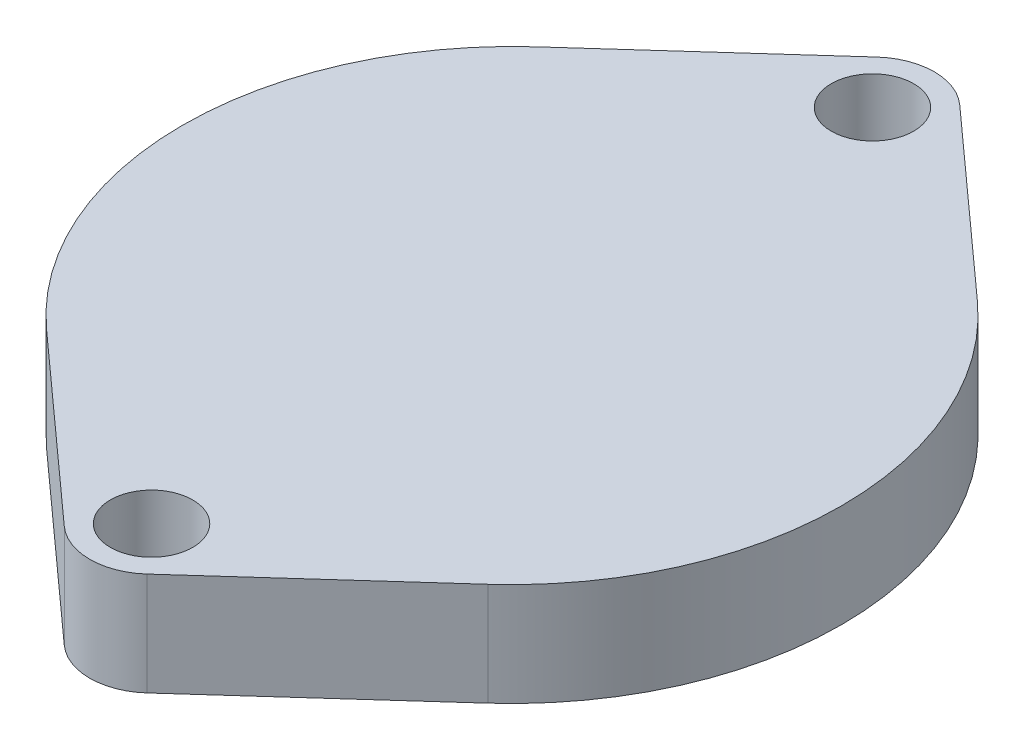
ISO-10303-21;
HEADER;
FILE_DESCRIPTION(('STEP AP214'),'2;1');
FILE_NAME('part.step','',(''),(''),'','','');
FILE_SCHEMA(('AUTOMOTIVE_DESIGN { 1 0 10303 214 1 1 1 1 }'));
ENDSEC;
DATA;
#1=APPLICATION_CONTEXT('core data for automotive mechanical design processes');
#2=APPLICATION_PROTOCOL_DEFINITION('international standard','automotive_design',2000,#1);
#3=PRODUCT_CONTEXT('',#1,'mechanical');
#4=PRODUCT('Part','Part','',(#3));
#5=PRODUCT_RELATED_PRODUCT_CATEGORY('part','',(#4));
#6=PRODUCT_DEFINITION_FORMATION('','',#4);
#7=PRODUCT_DEFINITION_CONTEXT('part definition',#1,'design');
#8=PRODUCT_DEFINITION('design','',#6,#7);
#9=PRODUCT_DEFINITION_SHAPE('','',#8);
#10=(LENGTH_UNIT() NAMED_UNIT(*) SI_UNIT(.MILLI.,.METRE.));
#11=(NAMED_UNIT(*) PLANE_ANGLE_UNIT() SI_UNIT($,.RADIAN.));
#12=(NAMED_UNIT(*) SI_UNIT($,.STERADIAN.) SOLID_ANGLE_UNIT());
#13=UNCERTAINTY_MEASURE_WITH_UNIT(LENGTH_MEASURE(1.E-05),#10,'distance_accuracy_value','');
#14=(GEOMETRIC_REPRESENTATION_CONTEXT(3) GLOBAL_UNCERTAINTY_ASSIGNED_CONTEXT((#13)) GLOBAL_UNIT_ASSIGNED_CONTEXT((#10,
#11,#12)) REPRESENTATION_CONTEXT('',''));
#15=CARTESIAN_POINT('',(0.,0.,0.));
#16=DIRECTION('',(0.,0.,1.));
#17=DIRECTION('',(1.,0.,0.));
#18=AXIS2_PLACEMENT_3D('',#15,#16,#17);
#19=CARTESIAN_POINT('',(0.,5.,17.5));
#20=DIRECTION('',(0.,-1.,0.));
#21=DIRECTION('',(0.,0.,-1.));
#22=AXIS2_PLACEMENT_3D('',#19,#20,#21);
#23=CYLINDRICAL_SURFACE('',#22,3.);
#24=CARTESIAN_POINT('',(0.,0.,17.5));
#25=DIRECTION('',(0.,1.,0.));
#26=DIRECTION('',(0.,0.,1.));
#27=AXIS2_PLACEMENT_3D('',#24,#25,#26);
#28=CIRCLE('',#27,3.);
#29=CARTESIAN_POINT('',(2.00834991666171,0.,19.7285714285714));
#30=VERTEX_POINT('',#29);
#31=CARTESIAN_POINT('',(-2.00834991666171,0.,19.7285714285714));
#32=VERTEX_POINT('',#31);
#33=EDGE_CURVE('E151',#30,#32,#28,.F.);
#34=ORIENTED_EDGE('',*,*,#33,.F.);
#35=DIRECTION('',(0.,-1.,0.));
#36=VECTOR('',#35,1.);
#37=CARTESIAN_POINT('',(2.00834991666171,5.,19.7285714285714));
#38=LINE('',#37,#36);
#39=CARTESIAN_POINT('',(2.00834991666171,5.,19.7285714285714));
#40=VERTEX_POINT('',#39);
#41=EDGE_CURVE('E11',#40,#30,#38,.T.);
#42=ORIENTED_EDGE('',*,*,#41,.F.);
#43=CARTESIAN_POINT('',(0.,5.,17.5));
#44=DIRECTION('',(0.,1.,0.));
#45=DIRECTION('',(0.,0.,1.));
#46=AXIS2_PLACEMENT_3D('',#43,#44,#45);
#47=CIRCLE('',#46,3.);
#48=CARTESIAN_POINT('',(-2.00834991666171,5.,19.7285714285714));
#49=VERTEX_POINT('',#48);
#50=EDGE_CURVE('E264',#40,#49,#47,.F.);
#51=ORIENTED_EDGE('',*,*,#50,.T.);
#52=DIRECTION('',(0.,-1.,0.));
#53=VECTOR('',#52,1.);
#54=CARTESIAN_POINT('',(-2.00834991666171,5.,19.7285714285714));
#55=LINE('',#54,#53);
#56=EDGE_CURVE('E52',#49,#32,#55,.T.);
#57=ORIENTED_EDGE('',*,*,#56,.T.);
#58=EDGE_LOOP('',(#34,#42,#51,#57));
#59=FACE_BOUND('',#58,.T.);
#60=ADVANCED_FACE('F35',(#59),#23,.T.);
#61=CARTESIAN_POINT('',(10.7111995555291,5.,11.8857142857143));
#62=DIRECTION('',(-0.66944997222057,0.,-0.742857142857143));
#63=DIRECTION('',(-0.742857142857143,0.,0.66944997222057));
#64=AXIS2_PLACEMENT_3D('',#61,#62,#63);
#65=PLANE('',#64);
#66=DIRECTION('',(0.742857142857143,0.,-0.66944997222057));
#67=VECTOR('',#66,1.);
#68=CARTESIAN_POINT('',(10.7111995555291,0.,11.8857142857143));
#69=LINE('',#68,#67);
#70=CARTESIAN_POINT('',(10.7111995555291,0.,11.8857142857143));
#71=VERTEX_POINT('',#70);
#72=EDGE_CURVE('E148',#30,#71,#69,.T.);
#73=ORIENTED_EDGE('',*,*,#72,.T.);
#74=DIRECTION('',(0.,-1.,0.));
#75=VECTOR('',#74,1.);
#76=CARTESIAN_POINT('',(10.7111995555291,5.,11.8857142857143));
#77=LINE('',#76,#75);
#78=CARTESIAN_POINT('',(10.7111995555291,5.,11.8857142857143));
#79=VERTEX_POINT('',#78);
#80=EDGE_CURVE('E44',#79,#71,#77,.T.);
#81=ORIENTED_EDGE('',*,*,#80,.F.);
#82=DIRECTION('',(0.742857142857143,0.,-0.66944997222057));
#83=VECTOR('',#82,1.);
#84=CARTESIAN_POINT('',(10.7111995555291,5.,11.8857142857143));
#85=LINE('',#84,#83);
#86=EDGE_CURVE('E266',#40,#79,#85,.T.);
#87=ORIENTED_EDGE('',*,*,#86,.F.);
#88=ORIENTED_EDGE('',*,*,#41,.T.);
#89=EDGE_LOOP('',(#73,#81,#87,#88));
#90=FACE_BOUND('',#89,.T.);
#91=ADVANCED_FACE('F149',(#90),#65,.F.);
#92=CARTESIAN_POINT('',(0.,5.,0.));
#93=DIRECTION('',(0.,-1.,0.));
#94=DIRECTION('',(0.,0.,-1.));
#95=AXIS2_PLACEMENT_3D('',#92,#93,#94);
#96=CYLINDRICAL_SURFACE('',#95,16.);
#97=CARTESIAN_POINT('',(0.,0.,0.));
#98=DIRECTION('',(0.,1.,0.));
#99=DIRECTION('',(0.,0.,1.));
#100=AXIS2_PLACEMENT_3D('',#97,#98,#99);
#101=CIRCLE('',#100,16.);
#102=CARTESIAN_POINT('',(10.7111995555291,0.,-11.8857142857143));
#103=VERTEX_POINT('',#102);
#104=EDGE_CURVE('E142',#103,#71,#101,.F.);
#105=ORIENTED_EDGE('',*,*,#104,.F.);
#106=DIRECTION('',(0.,-1.,0.));
#107=VECTOR('',#106,1.);
#108=CARTESIAN_POINT('',(10.7111995555291,5.,-11.8857142857143));
#109=LINE('',#108,#107);
#110=CARTESIAN_POINT('',(10.7111995555291,5.,-11.8857142857143));
#111=VERTEX_POINT('',#110);
#112=EDGE_CURVE('E134',#111,#103,#109,.T.);
#113=ORIENTED_EDGE('',*,*,#112,.F.);
#114=CARTESIAN_POINT('',(0.,5.,0.));
#115=DIRECTION('',(0.,1.,0.));
#116=DIRECTION('',(0.,0.,1.));
#117=AXIS2_PLACEMENT_3D('',#114,#115,#116);
#118=CIRCLE('',#117,16.);
#119=EDGE_CURVE('E145',#111,#79,#118,.F.);
#120=ORIENTED_EDGE('',*,*,#119,.T.);
#121=ORIENTED_EDGE('',*,*,#80,.T.);
#122=EDGE_LOOP('',(#105,#113,#120,#121));
#123=FACE_BOUND('',#122,.T.);
#124=ADVANCED_FACE('F140',(#123),#96,.T.);
#125=CARTESIAN_POINT('',(10.7111995555291,5.,-11.8857142857143));
#126=DIRECTION('',(0.66944997222057,0.,-0.742857142857143));
#127=DIRECTION('',(-0.742857142857143,0.,-0.66944997222057));
#128=AXIS2_PLACEMENT_3D('',#125,#126,#127);
#129=PLANE('',#128);
#130=DIRECTION('',(0.742857142857143,0.,0.66944997222057));
#131=VECTOR('',#130,1.);
#132=CARTESIAN_POINT('',(10.7111995555291,0.,-11.8857142857143));
#133=LINE('',#132,#131);
#134=CARTESIAN_POINT('',(2.00834991666171,0.,-19.7285714285714));
#135=VERTEX_POINT('',#134);
#136=EDGE_CURVE('E157',#135,#103,#133,.T.);
#137=ORIENTED_EDGE('',*,*,#136,.F.);
#138=DIRECTION('',(0.,-1.,0.));
#139=VECTOR('',#138,1.);
#140=CARTESIAN_POINT('',(2.00834991666171,5.,-19.7285714285714));
#141=LINE('',#140,#139);
#142=CARTESIAN_POINT('',(2.00834991666171,5.,-19.7285714285714));
#143=VERTEX_POINT('',#142);
#144=EDGE_CURVE('E128',#143,#135,#141,.T.);
#145=ORIENTED_EDGE('',*,*,#144,.F.);
#146=DIRECTION('',(0.742857142857143,0.,0.66944997222057));
#147=VECTOR('',#146,1.);
#148=CARTESIAN_POINT('',(10.7111995555291,5.,-11.8857142857143));
#149=LINE('',#148,#147);
#150=EDGE_CURVE('E271',#143,#111,#149,.T.);
#151=ORIENTED_EDGE('',*,*,#150,.T.);
#152=ORIENTED_EDGE('',*,*,#112,.T.);
#153=EDGE_LOOP('',(#137,#145,#151,#152));
#154=FACE_BOUND('',#153,.T.);
#155=ADVANCED_FACE('F201',(#154),#129,.T.);
#156=CARTESIAN_POINT('',(0.,5.,-17.5));
#157=DIRECTION('',(0.,-1.,0.));
#158=DIRECTION('',(0.,0.,-1.));
#159=AXIS2_PLACEMENT_3D('',#156,#157,#158);
#160=CYLINDRICAL_SURFACE('',#159,3.);
#161=CARTESIAN_POINT('',(0.,0.,-17.5));
#162=DIRECTION('',(0.,1.,0.));
#163=DIRECTION('',(0.,0.,1.));
#164=AXIS2_PLACEMENT_3D('',#161,#162,#163);
#165=CIRCLE('',#164,3.);
#166=CARTESIAN_POINT('',(-2.00834991666171,0.,-19.7285714285714));
#167=VERTEX_POINT('',#166);
#168=EDGE_CURVE('E159',#135,#167,#165,.T.);
#169=ORIENTED_EDGE('',*,*,#168,.T.);
#170=DIRECTION('',(0.,-1.,0.));
#171=VECTOR('',#170,1.);
#172=CARTESIAN_POINT('',(-2.00834991666171,5.,-19.7285714285714));
#173=LINE('',#172,#171);
#174=CARTESIAN_POINT('',(-2.00834991666171,5.,-19.7285714285714));
#175=VERTEX_POINT('',#174);
#176=EDGE_CURVE('E126',#175,#167,#173,.T.);
#177=ORIENTED_EDGE('',*,*,#176,.F.);
#178=CARTESIAN_POINT('',(0.,5.,-17.5));
#179=DIRECTION('',(0.,1.,0.));
#180=DIRECTION('',(0.,0.,1.));
#181=AXIS2_PLACEMENT_3D('',#178,#179,#180);
#182=CIRCLE('',#181,3.);
#183=EDGE_CURVE('E119',#143,#175,#182,.T.);
#184=ORIENTED_EDGE('',*,*,#183,.F.);
#185=ORIENTED_EDGE('',*,*,#144,.T.);
#186=EDGE_LOOP('',(#169,#177,#184,#185));
#187=FACE_BOUND('',#186,.T.);
#188=ADVANCED_FACE('F204',(#187),#160,.T.);
#189=CARTESIAN_POINT('',(-10.7111995555291,5.,-11.8857142857143));
#190=DIRECTION('',(0.66944997222057,0.,0.742857142857143));
#191=DIRECTION('',(0.742857142857143,0.,-0.66944997222057));
#192=AXIS2_PLACEMENT_3D('',#189,#190,#191);
#193=PLANE('',#192);
#194=DIRECTION('',(-0.742857142857143,0.,0.66944997222057));
#195=VECTOR('',#194,1.);
#196=CARTESIAN_POINT('',(-10.7111995555291,0.,-11.8857142857143));
#197=LINE('',#196,#195);
#198=CARTESIAN_POINT('',(-10.7111995555291,0.,-11.8857142857143));
#199=VERTEX_POINT('',#198);
#200=EDGE_CURVE('E125',#167,#199,#197,.T.);
#201=ORIENTED_EDGE('',*,*,#200,.T.);
#202=DIRECTION('',(0.,-1.,0.));
#203=VECTOR('',#202,1.);
#204=CARTESIAN_POINT('',(-10.7111995555291,5.,-11.8857142857143));
#205=LINE('',#204,#203);
#206=CARTESIAN_POINT('',(-10.7111995555291,5.,-11.8857142857143));
#207=VERTEX_POINT('',#206);
#208=EDGE_CURVE('E106',#207,#199,#205,.T.);
#209=ORIENTED_EDGE('',*,*,#208,.F.);
#210=DIRECTION('',(-0.742857142857143,0.,0.66944997222057));
#211=VECTOR('',#210,1.);
#212=CARTESIAN_POINT('',(-10.7111995555291,5.,-11.8857142857143));
#213=LINE('',#212,#211);
#214=EDGE_CURVE('E111',#175,#207,#213,.T.);
#215=ORIENTED_EDGE('',*,*,#214,.F.);
#216=ORIENTED_EDGE('',*,*,#176,.T.);
#217=EDGE_LOOP('',(#201,#209,#215,#216));
#218=FACE_BOUND('',#217,.T.);
#219=ADVANCED_FACE('F124',(#218),#193,.F.);
#220=CARTESIAN_POINT('',(0.,5.,0.));
#221=DIRECTION('',(0.,-1.,0.));
#222=DIRECTION('',(0.,0.,-1.));
#223=AXIS2_PLACEMENT_3D('',#220,#221,#222);
#224=CYLINDRICAL_SURFACE('',#223,16.);
#225=CARTESIAN_POINT('',(0.,0.,0.));
#226=DIRECTION('',(0.,1.,0.));
#227=DIRECTION('',(0.,0.,1.));
#228=AXIS2_PLACEMENT_3D('',#225,#226,#227);
#229=CIRCLE('',#228,16.);
#230=CARTESIAN_POINT('',(-10.7111995555291,0.,11.8857142857143));
#231=VERTEX_POINT('',#230);
#232=EDGE_CURVE('E166',#199,#231,#229,.T.);
#233=ORIENTED_EDGE('',*,*,#232,.T.);
#234=DIRECTION('',(0.,-1.,0.));
#235=VECTOR('',#234,1.);
#236=CARTESIAN_POINT('',(-10.7111995555291,5.,11.8857142857143));
#237=LINE('',#236,#235);
#238=CARTESIAN_POINT('',(-10.7111995555291,5.,11.8857142857143));
#239=VERTEX_POINT('',#238);
#240=EDGE_CURVE('E78',#239,#231,#237,.T.);
#241=ORIENTED_EDGE('',*,*,#240,.F.);
#242=CARTESIAN_POINT('',(0.,5.,0.));
#243=DIRECTION('',(0.,1.,0.));
#244=DIRECTION('',(0.,0.,1.));
#245=AXIS2_PLACEMENT_3D('',#242,#243,#244);
#246=CIRCLE('',#245,16.);
#247=EDGE_CURVE('E102',#207,#239,#246,.T.);
#248=ORIENTED_EDGE('',*,*,#247,.F.);
#249=ORIENTED_EDGE('',*,*,#208,.T.);
#250=EDGE_LOOP('',(#233,#241,#248,#249));
#251=FACE_BOUND('',#250,.T.);
#252=ADVANCED_FACE('F104',(#251),#224,.T.);
#253=CARTESIAN_POINT('',(-10.7111995555291,5.,11.8857142857143));
#254=DIRECTION('',(-0.66944997222057,0.,0.742857142857143));
#255=DIRECTION('',(0.742857142857143,0.,0.66944997222057));
#256=AXIS2_PLACEMENT_3D('',#253,#254,#255);
#257=PLANE('',#256);
#258=DIRECTION('',(-0.742857142857143,0.,-0.66944997222057));
#259=VECTOR('',#258,1.);
#260=CARTESIAN_POINT('',(-10.7111995555291,0.,11.8857142857143));
#261=LINE('',#260,#259);
#262=EDGE_CURVE('E168',#32,#231,#261,.T.);
#263=ORIENTED_EDGE('',*,*,#262,.F.);
#264=ORIENTED_EDGE('',*,*,#56,.F.);
#265=DIRECTION('',(-0.742857142857143,0.,-0.66944997222057));
#266=VECTOR('',#265,1.);
#267=CARTESIAN_POINT('',(-10.7111995555291,5.,11.8857142857143));
#268=LINE('',#267,#266);
#269=EDGE_CURVE('E110',#49,#239,#268,.T.);
#270=ORIENTED_EDGE('',*,*,#269,.T.);
#271=ORIENTED_EDGE('',*,*,#240,.T.);
#272=EDGE_LOOP('',(#263,#264,#270,#271));
#273=FACE_BOUND('',#272,.T.);
#274=ADVANCED_FACE('F182',(#273),#257,.T.);
#275=CARTESIAN_POINT('',(0.,5.,-17.5));
#276=DIRECTION('',(0.,-1.,0.));
#277=DIRECTION('',(0.,0.,-1.));
#278=AXIS2_PLACEMENT_3D('',#275,#276,#277);
#279=CYLINDRICAL_SURFACE('',#278,2.);
#280=CARTESIAN_POINT('',(0.,5.,-17.5));
#281=DIRECTION('',(0.,1.,0.));
#282=DIRECTION('',(0.,0.,1.));
#283=AXIS2_PLACEMENT_3D('',#280,#281,#282);
#284=CIRCLE('',#283,2.);
#285=CARTESIAN_POINT('',(0.,5.,-15.5));
#286=VERTEX_POINT('',#285);
#287=EDGE_CURVE('E173',#286,#286,#284,.T.);
#288=ORIENTED_EDGE('',*,*,#287,.T.);
#289=EDGE_LOOP('',(#288));
#290=FACE_BOUND('',#289,.T.);
#291=CARTESIAN_POINT('',(0.,0.,-17.5));
#292=DIRECTION('',(0.,1.,0.));
#293=DIRECTION('',(0.,0.,1.));
#294=AXIS2_PLACEMENT_3D('',#291,#292,#293);
#295=CIRCLE('',#294,2.);
#296=CARTESIAN_POINT('',(0.,0.,-15.5));
#297=VERTEX_POINT('',#296);
#298=EDGE_CURVE('E180',#297,#297,#295,.T.);
#299=ORIENTED_EDGE('',*,*,#298,.F.);
#300=EDGE_LOOP('',(#299));
#301=FACE_BOUND('',#300,.T.);
#302=ADVANCED_FACE('F37',(#290,#301),#279,.F.);
#303=CARTESIAN_POINT('',(0.,5.,17.5));
#304=DIRECTION('',(0.,-1.,0.));
#305=DIRECTION('',(0.,0.,-1.));
#306=AXIS2_PLACEMENT_3D('',#303,#304,#305);
#307=CYLINDRICAL_SURFACE('',#306,2.);
#308=CARTESIAN_POINT('',(0.,5.,17.5));
#309=DIRECTION('',(0.,1.,0.));
#310=DIRECTION('',(0.,0.,1.));
#311=AXIS2_PLACEMENT_3D('',#308,#309,#310);
#312=CIRCLE('',#311,2.);
#313=CARTESIAN_POINT('',(0.,5.,19.5));
#314=VERTEX_POINT('',#313);
#315=EDGE_CURVE('E174',#314,#314,#312,.F.);
#316=ORIENTED_EDGE('',*,*,#315,.F.);
#317=EDGE_LOOP('',(#316));
#318=FACE_BOUND('',#317,.T.);
#319=CARTESIAN_POINT('',(0.,0.,17.5));
#320=DIRECTION('',(0.,1.,0.));
#321=DIRECTION('',(0.,0.,1.));
#322=AXIS2_PLACEMENT_3D('',#319,#320,#321);
#323=CIRCLE('',#322,2.);
#324=CARTESIAN_POINT('',(0.,0.,19.5));
#325=VERTEX_POINT('',#324);
#326=EDGE_CURVE('E171',#325,#325,#323,.F.);
#327=ORIENTED_EDGE('',*,*,#326,.T.);
#328=EDGE_LOOP('',(#327));
#329=FACE_BOUND('',#328,.T.);
#330=ADVANCED_FACE('F189',(#318,#329),#307,.F.);
#331=CARTESIAN_POINT('',(0.,5.,0.));
#332=DIRECTION('',(0.,1.,0.));
#333=DIRECTION('',(0.,0.,1.));
#334=AXIS2_PLACEMENT_3D('',#331,#332,#333);
#335=PLANE('',#334);
#336=ORIENTED_EDGE('',*,*,#287,.F.);
#337=EDGE_LOOP('',(#336));
#338=FACE_BOUND('',#337,.T.);
#339=ORIENTED_EDGE('',*,*,#50,.F.);
#340=ORIENTED_EDGE('',*,*,#86,.T.);
#341=ORIENTED_EDGE('',*,*,#119,.F.);
#342=ORIENTED_EDGE('',*,*,#150,.F.);
#343=ORIENTED_EDGE('',*,*,#183,.T.);
#344=ORIENTED_EDGE('',*,*,#214,.T.);
#345=ORIENTED_EDGE('',*,*,#247,.T.);
#346=ORIENTED_EDGE('',*,*,#269,.F.);
#347=EDGE_LOOP('',(#339,#340,#341,#342,#343,#344,#345,#346));
#348=FACE_BOUND('',#347,.T.);
#349=ORIENTED_EDGE('',*,*,#315,.T.);
#350=EDGE_LOOP('',(#349));
#351=FACE_BOUND('',#350,.T.);
#352=ADVANCED_FACE('F115',(#338,#348,#351),#335,.T.);
#353=CARTESIAN_POINT('',(0.,0.,0.));
#354=DIRECTION('',(0.,1.,0.));
#355=DIRECTION('',(0.,0.,1.));
#356=AXIS2_PLACEMENT_3D('',#353,#354,#355);
#357=PLANE('',#356);
#358=ORIENTED_EDGE('',*,*,#298,.T.);
#359=EDGE_LOOP('',(#358));
#360=FACE_BOUND('',#359,.T.);
#361=ORIENTED_EDGE('',*,*,#33,.T.);
#362=ORIENTED_EDGE('',*,*,#262,.T.);
#363=ORIENTED_EDGE('',*,*,#232,.F.);
#364=ORIENTED_EDGE('',*,*,#200,.F.);
#365=ORIENTED_EDGE('',*,*,#168,.F.);
#366=ORIENTED_EDGE('',*,*,#136,.T.);
#367=ORIENTED_EDGE('',*,*,#104,.T.);
#368=ORIENTED_EDGE('',*,*,#72,.F.);
#369=EDGE_LOOP('',(#361,#362,#363,#364,#365,#366,#367,#368));
#370=FACE_BOUND('',#369,.T.);
#371=ORIENTED_EDGE('',*,*,#326,.F.);
#372=EDGE_LOOP('',(#371));
#373=FACE_BOUND('',#372,.T.);
#374=ADVANCED_FACE('F153',(#360,#370,#373),#357,.F.);
#375=CLOSED_SHELL('',(#60,#91,#124,#155,#188,#219,#252,#274,#302,#330,#352,#374));
#376=MANIFOLD_SOLID_BREP('B2',#375);
#377=ADVANCED_BREP_SHAPE_REPRESENTATION('',(#18,#376),#14);
#378=SHAPE_DEFINITION_REPRESENTATION(#9,#377);
ENDSEC;
END-ISO-10303-21;
